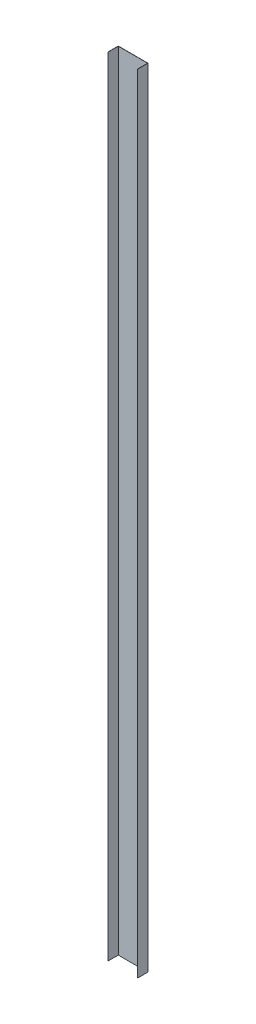
ISO-10303-21;
HEADER;
FILE_DESCRIPTION(('STEP AP214'),'2;1');
FILE_NAME('part.step','',(''),(''),'','','');
FILE_SCHEMA(('AUTOMOTIVE_DESIGN { 1 0 10303 214 1 1 1 1 }'));
ENDSEC;
DATA;
#1=APPLICATION_CONTEXT('core data for automotive mechanical design processes');
#2=APPLICATION_PROTOCOL_DEFINITION('international standard','automotive_design',2000,#1);
#3=PRODUCT_CONTEXT('',#1,'mechanical');
#4=PRODUCT('Part','Part','',(#3));
#5=PRODUCT_RELATED_PRODUCT_CATEGORY('part','',(#4));
#6=PRODUCT_DEFINITION_FORMATION('','',#4);
#7=PRODUCT_DEFINITION_CONTEXT('part definition',#1,'design');
#8=PRODUCT_DEFINITION('design','',#6,#7);
#9=PRODUCT_DEFINITION_SHAPE('','',#8);
#10=(LENGTH_UNIT() NAMED_UNIT(*) SI_UNIT(.MILLI.,.METRE.));
#11=(NAMED_UNIT(*) PLANE_ANGLE_UNIT() SI_UNIT($,.RADIAN.));
#12=(NAMED_UNIT(*) SI_UNIT($,.STERADIAN.) SOLID_ANGLE_UNIT());
#13=UNCERTAINTY_MEASURE_WITH_UNIT(LENGTH_MEASURE(1.E-05),#10,'distance_accuracy_value','');
#14=(GEOMETRIC_REPRESENTATION_CONTEXT(3) GLOBAL_UNCERTAINTY_ASSIGNED_CONTEXT((#13)) GLOBAL_UNIT_ASSIGNED_CONTEXT((#10,
#11,#12)) REPRESENTATION_CONTEXT('',''));
#15=CARTESIAN_POINT('',(0.,0.,0.));
#16=DIRECTION('',(0.,0.,1.));
#17=DIRECTION('',(1.,0.,0.));
#18=AXIS2_PLACEMENT_3D('',#15,#16,#17);
#19=CARTESIAN_POINT('',(-0.530999999999989,2438.4,0.));
#20=DIRECTION('',(0.,0.,-1.));
#21=DIRECTION('',(-1.,0.,0.));
#22=AXIS2_PLACEMENT_3D('',#19,#20,#21);
#23=PLANE('',#22);
#24=DIRECTION('',(1.,0.,0.));
#25=VECTOR('',#24,1.);
#26=CARTESIAN_POINT('',(-0.530999999999989,0.,0.));
#27=LINE('',#26,#25);
#28=CARTESIAN_POINT('',(-0.530999999999989,0.,0.));
#29=VERTEX_POINT('',#28);
#30=CARTESIAN_POINT('',(0.,0.,0.));
#31=VERTEX_POINT('',#30);
#32=EDGE_CURVE('E129',#29,#31,#27,.T.);
#33=ORIENTED_EDGE('',*,*,#32,.T.);
#34=DIRECTION('',(0.,-1.,0.));
#35=VECTOR('',#34,1.);
#36=CARTESIAN_POINT('',(0.,2438.4,0.));
#37=LINE('',#36,#35);
#38=CARTESIAN_POINT('',(0.,2438.4,0.));
#39=VERTEX_POINT('',#38);
#40=EDGE_CURVE('E11',#39,#31,#37,.T.);
#41=ORIENTED_EDGE('',*,*,#40,.F.);
#42=DIRECTION('',(1.,0.,0.));
#43=VECTOR('',#42,1.);
#44=CARTESIAN_POINT('',(-0.530999999999989,2438.4,0.));
#45=LINE('',#44,#43);
#46=CARTESIAN_POINT('',(-0.530999999999989,2438.4,0.));
#47=VERTEX_POINT('',#46);
#48=EDGE_CURVE('E143',#47,#39,#45,.T.);
#49=ORIENTED_EDGE('',*,*,#48,.F.);
#50=DIRECTION('',(0.,-1.,0.));
#51=VECTOR('',#50,1.);
#52=CARTESIAN_POINT('',(-0.530999999999989,2438.4,0.));
#53=LINE('',#52,#51);
#54=EDGE_CURVE('E125',#47,#29,#53,.T.);
#55=ORIENTED_EDGE('',*,*,#54,.T.);
#56=EDGE_LOOP('',(#33,#41,#49,#55));
#57=FACE_BOUND('',#56,.T.);
#58=ADVANCED_FACE('F33',(#57),#23,.F.);
#59=CARTESIAN_POINT('',(0.,2438.4,0.));
#60=DIRECTION('',(-1.,0.,0.));
#61=DIRECTION('',(0.,0.,1.));
#62=AXIS2_PLACEMENT_3D('',#59,#60,#61);
#63=PLANE('',#62);
#64=DIRECTION('',(0.,0.,-1.));
#65=VECTOR('',#64,1.);
#66=CARTESIAN_POINT('',(0.,0.,0.));
#67=LINE('',#66,#65);
#68=CARTESIAN_POINT('',(0.,0.,-31.219));
#69=VERTEX_POINT('',#68);
#70=EDGE_CURVE('E132',#31,#69,#67,.T.);
#71=ORIENTED_EDGE('',*,*,#70,.T.);
#72=DIRECTION('',(0.,-1.,0.));
#73=VECTOR('',#72,1.);
#74=CARTESIAN_POINT('',(0.,2438.4,-31.219));
#75=LINE('',#74,#73);
#76=CARTESIAN_POINT('',(0.,2438.4,-31.219));
#77=VERTEX_POINT('',#76);
#78=EDGE_CURVE('E41',#77,#69,#75,.T.);
#79=ORIENTED_EDGE('',*,*,#78,.F.);
#80=DIRECTION('',(0.,0.,-1.));
#81=VECTOR('',#80,1.);
#82=CARTESIAN_POINT('',(0.,2438.4,0.));
#83=LINE('',#82,#81);
#84=EDGE_CURVE('E92',#39,#77,#83,.T.);
#85=ORIENTED_EDGE('',*,*,#84,.F.);
#86=ORIENTED_EDGE('',*,*,#40,.T.);
#87=EDGE_LOOP('',(#71,#79,#85,#86));
#88=FACE_BOUND('',#87,.T.);
#89=ADVANCED_FACE('F178',(#88),#63,.F.);
#90=CARTESIAN_POINT('',(0.,2438.4,-31.219));
#91=DIRECTION('',(0.,0.,-1.));
#92=DIRECTION('',(-1.,0.,0.));
#93=AXIS2_PLACEMENT_3D('',#90,#91,#92);
#94=PLANE('',#93);
#95=DIRECTION('',(1.,0.,0.));
#96=VECTOR('',#95,1.);
#97=CARTESIAN_POINT('',(0.,0.,-31.219));
#98=LINE('',#97,#96);
#99=CARTESIAN_POINT('',(91.013,0.,-31.219));
#100=VERTEX_POINT('',#99);
#101=EDGE_CURVE('E134',#69,#100,#98,.T.);
#102=ORIENTED_EDGE('',*,*,#101,.T.);
#103=DIRECTION('',(0.,-1.,0.));
#104=VECTOR('',#103,1.);
#105=CARTESIAN_POINT('',(91.013,2438.4,-31.219));
#106=LINE('',#105,#104);
#107=CARTESIAN_POINT('',(91.013,2438.4,-31.219));
#108=VERTEX_POINT('',#107);
#109=EDGE_CURVE('E150',#108,#100,#106,.T.);
#110=ORIENTED_EDGE('',*,*,#109,.F.);
#111=DIRECTION('',(1.,0.,0.));
#112=VECTOR('',#111,1.);
#113=CARTESIAN_POINT('',(0.,2438.4,-31.219));
#114=LINE('',#113,#112);
#115=EDGE_CURVE('E158',#77,#108,#114,.T.);
#116=ORIENTED_EDGE('',*,*,#115,.F.);
#117=ORIENTED_EDGE('',*,*,#78,.T.);
#118=EDGE_LOOP('',(#102,#110,#116,#117));
#119=FACE_BOUND('',#118,.T.);
#120=ADVANCED_FACE('F156',(#119),#94,.F.);
#121=CARTESIAN_POINT('',(91.013,2438.4,-31.219));
#122=DIRECTION('',(1.,0.,0.));
#123=DIRECTION('',(0.,0.,-1.));
#124=AXIS2_PLACEMENT_3D('',#121,#122,#123);
#125=PLANE('',#124);
#126=DIRECTION('',(0.,0.,1.));
#127=VECTOR('',#126,1.);
#128=CARTESIAN_POINT('',(91.013,0.,-31.219));
#129=LINE('',#128,#127);
#130=CARTESIAN_POINT('',(91.013,0.,0.));
#131=VERTEX_POINT('',#130);
#132=EDGE_CURVE('E136',#100,#131,#129,.T.);
#133=ORIENTED_EDGE('',*,*,#132,.T.);
#134=DIRECTION('',(0.,-1.,0.));
#135=VECTOR('',#134,1.);
#136=CARTESIAN_POINT('',(91.013,2438.4,0.));
#137=LINE('',#136,#135);
#138=CARTESIAN_POINT('',(91.013,2438.4,0.));
#139=VERTEX_POINT('',#138);
#140=EDGE_CURVE('E147',#139,#131,#137,.T.);
#141=ORIENTED_EDGE('',*,*,#140,.F.);
#142=DIRECTION('',(0.,0.,1.));
#143=VECTOR('',#142,1.);
#144=CARTESIAN_POINT('',(91.013,2438.4,-31.219));
#145=LINE('',#144,#143);
#146=EDGE_CURVE('E170',#108,#139,#145,.T.);
#147=ORIENTED_EDGE('',*,*,#146,.F.);
#148=ORIENTED_EDGE('',*,*,#109,.T.);
#149=EDGE_LOOP('',(#133,#141,#147,#148));
#150=FACE_BOUND('',#149,.T.);
#151=ADVANCED_FACE('F166',(#150),#125,.F.);
#152=CARTESIAN_POINT('',(91.013,2438.4,0.));
#153=DIRECTION('',(0.,0.,-1.));
#154=DIRECTION('',(-1.,0.,0.));
#155=AXIS2_PLACEMENT_3D('',#152,#153,#154);
#156=PLANE('',#155);
#157=DIRECTION('',(1.,0.,0.));
#158=VECTOR('',#157,1.);
#159=CARTESIAN_POINT('',(91.013,0.,0.));
#160=LINE('',#159,#158);
#161=CARTESIAN_POINT('',(91.544,0.,0.));
#162=VERTEX_POINT('',#161);
#163=EDGE_CURVE('E138',#131,#162,#160,.T.);
#164=ORIENTED_EDGE('',*,*,#163,.T.);
#165=DIRECTION('',(0.,-1.,0.));
#166=VECTOR('',#165,1.);
#167=CARTESIAN_POINT('',(91.544,2438.4,0.));
#168=LINE('',#167,#166);
#169=CARTESIAN_POINT('',(91.544,2438.4,0.));
#170=VERTEX_POINT('',#169);
#171=EDGE_CURVE('E120',#170,#162,#168,.T.);
#172=ORIENTED_EDGE('',*,*,#171,.F.);
#173=DIRECTION('',(1.,0.,0.));
#174=VECTOR('',#173,1.);
#175=CARTESIAN_POINT('',(91.013,2438.4,0.));
#176=LINE('',#175,#174);
#177=EDGE_CURVE('E111',#139,#170,#176,.T.);
#178=ORIENTED_EDGE('',*,*,#177,.F.);
#179=ORIENTED_EDGE('',*,*,#140,.T.);
#180=EDGE_LOOP('',(#164,#172,#178,#179));
#181=FACE_BOUND('',#180,.T.);
#182=ADVANCED_FACE('F169',(#181),#156,.F.);
#183=CARTESIAN_POINT('',(91.544,2438.4,0.));
#184=DIRECTION('',(-1.,0.,0.));
#185=DIRECTION('',(0.,0.,1.));
#186=AXIS2_PLACEMENT_3D('',#183,#184,#185);
#187=PLANE('',#186);
#188=DIRECTION('',(0.,0.,-1.));
#189=VECTOR('',#188,1.);
#190=CARTESIAN_POINT('',(91.544,0.,0.));
#191=LINE('',#190,#189);
#192=CARTESIAN_POINT('',(91.544,0.,-31.75));
#193=VERTEX_POINT('',#192);
#194=EDGE_CURVE('E119',#162,#193,#191,.T.);
#195=ORIENTED_EDGE('',*,*,#194,.T.);
#196=DIRECTION('',(0.,-1.,0.));
#197=VECTOR('',#196,1.);
#198=CARTESIAN_POINT('',(91.544,2438.4,-31.75));
#199=LINE('',#198,#197);
#200=CARTESIAN_POINT('',(91.544,2438.4,-31.75));
#201=VERTEX_POINT('',#200);
#202=EDGE_CURVE('E116',#201,#193,#199,.T.);
#203=ORIENTED_EDGE('',*,*,#202,.F.);
#204=DIRECTION('',(0.,0.,-1.));
#205=VECTOR('',#204,1.);
#206=CARTESIAN_POINT('',(91.544,2438.4,0.));
#207=LINE('',#206,#205);
#208=EDGE_CURVE('E105',#170,#201,#207,.T.);
#209=ORIENTED_EDGE('',*,*,#208,.F.);
#210=ORIENTED_EDGE('',*,*,#171,.T.);
#211=EDGE_LOOP('',(#195,#203,#209,#210));
#212=FACE_BOUND('',#211,.T.);
#213=ADVANCED_FACE('F117',(#212),#187,.F.);
#214=CARTESIAN_POINT('',(91.544,2438.4,-31.75));
#215=DIRECTION('',(0.,0.,1.));
#216=DIRECTION('',(1.,0.,0.));
#217=AXIS2_PLACEMENT_3D('',#214,#215,#216);
#218=PLANE('',#217);
#219=DIRECTION('',(-1.,0.,0.));
#220=VECTOR('',#219,1.);
#221=CARTESIAN_POINT('',(91.544,0.,-31.75));
#222=LINE('',#221,#220);
#223=CARTESIAN_POINT('',(-0.530999999999993,0.,-31.75));
#224=VERTEX_POINT('',#223);
#225=EDGE_CURVE('E78',#193,#224,#222,.T.);
#226=ORIENTED_EDGE('',*,*,#225,.T.);
#227=DIRECTION('',(0.,-1.,0.));
#228=VECTOR('',#227,1.);
#229=CARTESIAN_POINT('',(-0.530999999999993,2438.4,-31.75));
#230=LINE('',#229,#228);
#231=CARTESIAN_POINT('',(-0.530999999999993,2438.4,-31.75));
#232=VERTEX_POINT('',#231);
#233=EDGE_CURVE('E121',#232,#224,#230,.T.);
#234=ORIENTED_EDGE('',*,*,#233,.F.);
#235=DIRECTION('',(-1.,0.,0.));
#236=VECTOR('',#235,1.);
#237=CARTESIAN_POINT('',(91.544,2438.4,-31.75));
#238=LINE('',#237,#236);
#239=EDGE_CURVE('E109',#201,#232,#238,.T.);
#240=ORIENTED_EDGE('',*,*,#239,.F.);
#241=ORIENTED_EDGE('',*,*,#202,.T.);
#242=EDGE_LOOP('',(#226,#234,#240,#241));
#243=FACE_BOUND('',#242,.T.);
#244=ADVANCED_FACE('F123',(#243),#218,.F.);
#245=CARTESIAN_POINT('',(-0.530999999999993,2438.4,-31.75));
#246=DIRECTION('',(1.,0.,0.));
#247=DIRECTION('',(0.,0.,-1.));
#248=AXIS2_PLACEMENT_3D('',#245,#246,#247);
#249=PLANE('',#248);
#250=DIRECTION('',(0.,0.,1.));
#251=VECTOR('',#250,1.);
#252=CARTESIAN_POINT('',(-0.530999999999993,0.,-31.75));
#253=LINE('',#252,#251);
#254=EDGE_CURVE('E84',#224,#29,#253,.T.);
#255=ORIENTED_EDGE('',*,*,#254,.T.);
#256=ORIENTED_EDGE('',*,*,#54,.F.);
#257=DIRECTION('',(0.,0.,1.));
#258=VECTOR('',#257,1.);
#259=CARTESIAN_POINT('',(-0.530999999999993,2438.4,-31.75));
#260=LINE('',#259,#258);
#261=EDGE_CURVE('E49',#232,#47,#260,.T.);
#262=ORIENTED_EDGE('',*,*,#261,.F.);
#263=ORIENTED_EDGE('',*,*,#233,.T.);
#264=EDGE_LOOP('',(#255,#256,#262,#263));
#265=FACE_BOUND('',#264,.T.);
#266=ADVANCED_FACE('F194',(#265),#249,.F.);
#267=CARTESIAN_POINT('',(0.,2438.4,0.));
#268=DIRECTION('',(0.,1.,0.));
#269=DIRECTION('',(0.,0.,1.));
#270=AXIS2_PLACEMENT_3D('',#267,#268,#269);
#271=PLANE('',#270);
#272=ORIENTED_EDGE('',*,*,#48,.T.);
#273=ORIENTED_EDGE('',*,*,#84,.T.);
#274=ORIENTED_EDGE('',*,*,#115,.T.);
#275=ORIENTED_EDGE('',*,*,#146,.T.);
#276=ORIENTED_EDGE('',*,*,#177,.T.);
#277=ORIENTED_EDGE('',*,*,#208,.T.);
#278=ORIENTED_EDGE('',*,*,#239,.T.);
#279=ORIENTED_EDGE('',*,*,#261,.T.);
#280=EDGE_LOOP('',(#272,#273,#274,#275,#276,#277,#278,#279));
#281=FACE_BOUND('',#280,.T.);
#282=ADVANCED_FACE('F107',(#281),#271,.T.);
#283=CARTESIAN_POINT('',(0.,0.,0.));
#284=DIRECTION('',(0.,1.,0.));
#285=DIRECTION('',(0.,0.,1.));
#286=AXIS2_PLACEMENT_3D('',#283,#284,#285);
#287=PLANE('',#286);
#288=ORIENTED_EDGE('',*,*,#32,.F.);
#289=ORIENTED_EDGE('',*,*,#254,.F.);
#290=ORIENTED_EDGE('',*,*,#225,.F.);
#291=ORIENTED_EDGE('',*,*,#194,.F.);
#292=ORIENTED_EDGE('',*,*,#163,.F.);
#293=ORIENTED_EDGE('',*,*,#132,.F.);
#294=ORIENTED_EDGE('',*,*,#101,.F.);
#295=ORIENTED_EDGE('',*,*,#70,.F.);
#296=EDGE_LOOP('',(#288,#289,#290,#291,#292,#293,#294,#295));
#297=FACE_BOUND('',#296,.T.);
#298=ADVANCED_FACE('F162',(#297),#287,.F.);
#299=CLOSED_SHELL('',(#58,#89,#120,#151,#182,#213,#244,#266,#282,#298));
#300=MANIFOLD_SOLID_BREP('B2',#299);
#301=ADVANCED_BREP_SHAPE_REPRESENTATION('',(#18,#300),#14);
#302=SHAPE_DEFINITION_REPRESENTATION(#9,#301);
ENDSEC;
END-ISO-10303-21;
